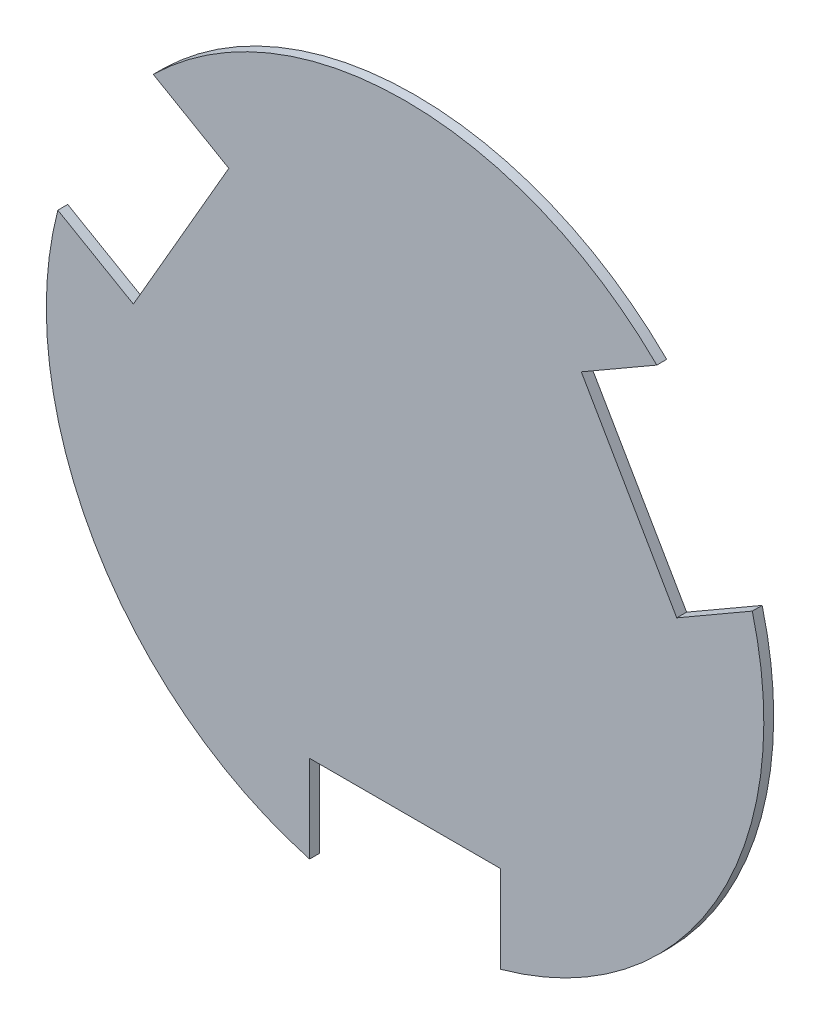
ISO-10303-21;
HEADER;
FILE_DESCRIPTION(('STEP AP214'),'2;1');
FILE_NAME('part.step','',(''),(''),'','','');
FILE_SCHEMA(('AUTOMOTIVE_DESIGN { 1 0 10303 214 1 1 1 1 }'));
ENDSEC;
DATA;
#1=APPLICATION_CONTEXT('core data for automotive mechanical design processes');
#2=APPLICATION_PROTOCOL_DEFINITION('international standard','automotive_design',2000,#1);
#3=PRODUCT_CONTEXT('',#1,'mechanical');
#4=PRODUCT('Part','Part','',(#3));
#5=PRODUCT_RELATED_PRODUCT_CATEGORY('part','',(#4));
#6=PRODUCT_DEFINITION_FORMATION('','',#4);
#7=PRODUCT_DEFINITION_CONTEXT('part definition',#1,'design');
#8=PRODUCT_DEFINITION('design','',#6,#7);
#9=PRODUCT_DEFINITION_SHAPE('','',#8);
#10=(LENGTH_UNIT() NAMED_UNIT(*) SI_UNIT(.MILLI.,.METRE.));
#11=(NAMED_UNIT(*) PLANE_ANGLE_UNIT() SI_UNIT($,.RADIAN.));
#12=(NAMED_UNIT(*) SI_UNIT($,.STERADIAN.) SOLID_ANGLE_UNIT());
#13=UNCERTAINTY_MEASURE_WITH_UNIT(LENGTH_MEASURE(1.E-05),#10,'distance_accuracy_value','');
#14=(GEOMETRIC_REPRESENTATION_CONTEXT(3) GLOBAL_UNCERTAINTY_ASSIGNED_CONTEXT((#13)) GLOBAL_UNIT_ASSIGNED_CONTEXT((#10,
#11,#12)) REPRESENTATION_CONTEXT('',''));
#15=CARTESIAN_POINT('',(0.,0.,0.));
#16=DIRECTION('',(0.,0.,1.));
#17=DIRECTION('',(1.,0.,0.));
#18=AXIS2_PLACEMENT_3D('',#15,#16,#17);
#19=CARTESIAN_POINT('',(0.,0.,3.));
#20=DIRECTION('',(0.,0.,-1.));
#21=DIRECTION('',(-1.,0.,0.));
#22=AXIS2_PLACEMENT_3D('',#19,#20,#21);
#23=CYLINDRICAL_SURFACE('',#22,109.);
#24=CARTESIAN_POINT('',(0.,0.,0.));
#25=DIRECTION('',(0.,0.,1.));
#26=DIRECTION('',(1.,0.,0.));
#27=AXIS2_PLACEMENT_3D('',#24,#25,#26);
#28=CIRCLE('',#27,109.);
#29=CARTESIAN_POINT('',(-105.494505328619,27.4209654365062,0.));
#30=VERTEX_POINT('',#29);
#31=CARTESIAN_POINT('',(-29.,-105.07140429251,0.));
#32=VERTEX_POINT('',#31);
#33=EDGE_CURVE('E244',#30,#32,#28,.T.);
#34=ORIENTED_EDGE('',*,*,#33,.T.);
#35=DIRECTION('',(0.,0.,-1.));
#36=VECTOR('',#35,1.);
#37=CARTESIAN_POINT('',(-29.,-105.07140429251,3.));
#38=LINE('',#37,#36);
#39=CARTESIAN_POINT('',(-29.,-105.07140429251,3.));
#40=VERTEX_POINT('',#39);
#41=EDGE_CURVE('E144',#32,#40,#38,.F.);
#42=ORIENTED_EDGE('',*,*,#41,.T.);
#43=CARTESIAN_POINT('',(0.,0.,3.));
#44=DIRECTION('',(0.,0.,1.));
#45=DIRECTION('',(1.,0.,0.));
#46=AXIS2_PLACEMENT_3D('',#43,#44,#45);
#47=CIRCLE('',#46,109.);
#48=CARTESIAN_POINT('',(-105.494505328619,27.4209654365062,3.));
#49=VERTEX_POINT('',#48);
#50=EDGE_CURVE('E238',#49,#40,#47,.T.);
#51=ORIENTED_EDGE('',*,*,#50,.F.);
#52=DIRECTION('',(0.,0.,-1.));
#53=VECTOR('',#52,1.);
#54=CARTESIAN_POINT('',(-105.494505328619,27.4209654365062,3.));
#55=LINE('',#54,#53);
#56=EDGE_CURVE('E219',#49,#30,#55,.T.);
#57=ORIENTED_EDGE('',*,*,#56,.T.);
#58=EDGE_LOOP('',(#34,#42,#51,#57));
#59=FACE_BOUND('',#58,.T.);
#60=ADVANCED_FACE('F39',(#59),#23,.T.);
#61=CARTESIAN_POINT('',(76.4945053286188,77.6504388560033,0.));
#62=VERTEX_POINT('',#61);
#63=CARTESIAN_POINT('',(-76.4945053286185,77.6504388560036,0.));
#64=VERTEX_POINT('',#63);
#65=EDGE_CURVE('E239',#62,#64,#28,.T.);
#66=ORIENTED_EDGE('',*,*,#65,.T.);
#67=DIRECTION('',(0.,0.,-1.));
#68=VECTOR('',#67,1.);
#69=CARTESIAN_POINT('',(-76.4945053286185,77.6504388560036,3.));
#70=LINE('',#69,#68);
#71=CARTESIAN_POINT('',(-76.4945053286185,77.6504388560036,3.));
#72=VERTEX_POINT('',#71);
#73=EDGE_CURVE('E223',#64,#72,#70,.F.);
#74=ORIENTED_EDGE('',*,*,#73,.T.);
#75=CARTESIAN_POINT('',(76.4945053286188,77.6504388560033,3.));
#76=VERTEX_POINT('',#75);
#77=EDGE_CURVE('E240',#76,#72,#47,.T.);
#78=ORIENTED_EDGE('',*,*,#77,.F.);
#79=DIRECTION('',(0.,0.,-1.));
#80=VECTOR('',#79,1.);
#81=CARTESIAN_POINT('',(76.4945053286188,77.6504388560033,3.));
#82=LINE('',#81,#80);
#83=EDGE_CURVE('E137',#76,#62,#82,.T.);
#84=ORIENTED_EDGE('',*,*,#83,.T.);
#85=EDGE_LOOP('',(#66,#74,#78,#84));
#86=FACE_BOUND('',#85,.T.);
#87=ADVANCED_FACE('F268',(#86),#23,.T.);
#88=CARTESIAN_POINT('',(29.,-105.07140429251,3.));
#89=VERTEX_POINT('',#88);
#90=CARTESIAN_POINT('',(105.494505328619,27.4209654365058,3.));
#91=VERTEX_POINT('',#90);
#92=EDGE_CURVE('E234',#89,#91,#47,.T.);
#93=ORIENTED_EDGE('',*,*,#92,.F.);
#94=DIRECTION('',(0.,0.,-1.));
#95=VECTOR('',#94,1.);
#96=CARTESIAN_POINT('',(29.,-105.07140429251,3.));
#97=LINE('',#96,#95);
#98=CARTESIAN_POINT('',(29.,-105.07140429251,0.));
#99=VERTEX_POINT('',#98);
#100=EDGE_CURVE('E227',#89,#99,#97,.T.);
#101=ORIENTED_EDGE('',*,*,#100,.T.);
#102=CARTESIAN_POINT('',(105.494505328619,27.4209654365058,0.));
#103=VERTEX_POINT('',#102);
#104=EDGE_CURVE('E233',#99,#103,#28,.T.);
#105=ORIENTED_EDGE('',*,*,#104,.T.);
#106=DIRECTION('',(0.,0.,-1.));
#107=VECTOR('',#106,1.);
#108=CARTESIAN_POINT('',(105.494505328619,27.4209654365058,3.));
#109=LINE('',#108,#107);
#110=EDGE_CURVE('E215',#103,#91,#109,.F.);
#111=ORIENTED_EDGE('',*,*,#110,.T.);
#112=EDGE_LOOP('',(#93,#101,#105,#111));
#113=FACE_BOUND('',#112,.T.);
#114=ADVANCED_FACE('F41',(#113),#23,.T.);
#115=CARTESIAN_POINT('',(0.,0.,3.));
#116=DIRECTION('',(0.,0.,1.));
#117=DIRECTION('',(1.,0.,0.));
#118=AXIS2_PLACEMENT_3D('',#115,#116,#117);
#119=PLANE('',#118);
#120=DIRECTION('',(0.,-1.,0.));
#121=VECTOR('',#120,1.);
#122=CARTESIAN_POINT('',(-29.,-120.989097303289,3.));
#123=LINE('',#122,#121);
#124=CARTESIAN_POINT('',(-29.,-78.5714042925096,3.));
#125=VERTEX_POINT('',#124);
#126=EDGE_CURVE('E157',#125,#40,#123,.T.);
#127=ORIENTED_EDGE('',*,*,#126,.F.);
#128=DIRECTION('',(-1.,0.,0.));
#129=VECTOR('',#128,1.);
#130=CARTESIAN_POINT('',(-29.,-78.5714042925096,3.));
#131=LINE('',#130,#129);
#132=CARTESIAN_POINT('',(29.,-78.5714042925096,3.));
#133=VERTEX_POINT('',#132);
#134=EDGE_CURVE('E133',#133,#125,#131,.T.);
#135=ORIENTED_EDGE('',*,*,#134,.F.);
#136=DIRECTION('',(0.,1.,0.));
#137=VECTOR('',#136,1.);
#138=CARTESIAN_POINT('',(29.,-120.989097303289,3.));
#139=LINE('',#138,#137);
#140=EDGE_CURVE('E160',#89,#133,#139,.T.);
#141=ORIENTED_EDGE('',*,*,#140,.F.);
#142=ORIENTED_EDGE('',*,*,#92,.T.);
#143=DIRECTION('',(0.86602540378443,0.500000000000015,0.));
#144=VECTOR('',#143,1.);
#145=CARTESIAN_POINT('',(119.279631845596,35.3798119418958,3.));
#146=LINE('',#145,#144);
#147=CARTESIAN_POINT('',(82.5448321283311,14.1709654365053,3.));
#148=VERTEX_POINT('',#147);
#149=EDGE_CURVE('E198',#148,#91,#146,.T.);
#150=ORIENTED_EDGE('',*,*,#149,.F.);
#151=DIRECTION('',(0.499999999999992,-0.866025403784443,0.));
#152=VECTOR('',#151,1.);
#153=CARTESIAN_POINT('',(82.5448321283311,14.1709654365053,3.));
#154=LINE('',#153,#152);
#155=CARTESIAN_POINT('',(53.5448321283316,64.400438856003,3.));
#156=VERTEX_POINT('',#155);
#157=EDGE_CURVE('E193',#156,#148,#154,.T.);
#158=ORIENTED_EDGE('',*,*,#157,.F.);
#159=DIRECTION('',(-0.86602540378443,-0.500000000000015,0.));
#160=VECTOR('',#159,1.);
#161=CARTESIAN_POINT('',(90.2796318455955,85.6092853613932,3.));
#162=LINE('',#161,#160);
#163=EDGE_CURVE('E201',#76,#156,#162,.T.);
#164=ORIENTED_EDGE('',*,*,#163,.F.);
#165=ORIENTED_EDGE('',*,*,#77,.T.);
#166=DIRECTION('',(-0.866025403784442,0.499999999999994,0.));
#167=VECTOR('',#166,1.);
#168=CARTESIAN_POINT('',(-90.2796318455954,85.6092853613932,3.));
#169=LINE('',#168,#167);
#170=CARTESIAN_POINT('',(-53.5448321283307,64.4004388560038,3.));
#171=VERTEX_POINT('',#170);
#172=EDGE_CURVE('E174',#171,#72,#169,.T.);
#173=ORIENTED_EDGE('',*,*,#172,.F.);
#174=DIRECTION('',(0.500000000000004,0.866025403784436,0.));
#175=VECTOR('',#174,1.);
#176=CARTESIAN_POINT('',(-53.5448321283307,64.4004388560038,3.));
#177=LINE('',#176,#175);
#178=CARTESIAN_POINT('',(-82.5448321283309,14.1709654365065,3.));
#179=VERTEX_POINT('',#178);
#180=EDGE_CURVE('E170',#179,#171,#177,.T.);
#181=ORIENTED_EDGE('',*,*,#180,.F.);
#182=DIRECTION('',(0.866025403784442,-0.499999999999994,0.));
#183=VECTOR('',#182,1.);
#184=CARTESIAN_POINT('',(-119.279631845595,35.3798119418957,3.));
#185=LINE('',#184,#183);
#186=EDGE_CURVE('E177',#49,#179,#185,.T.);
#187=ORIENTED_EDGE('',*,*,#186,.F.);
#188=ORIENTED_EDGE('',*,*,#50,.T.);
#189=EDGE_LOOP('',(#127,#135,#141,#142,#150,#158,#164,#165,#173,#181,#187,#188));
#190=FACE_BOUND('',#189,.T.);
#191=ADVANCED_FACE('F263',(#190),#119,.T.);
#192=CARTESIAN_POINT('',(0.,0.,0.));
#193=DIRECTION('',(0.,0.,1.));
#194=DIRECTION('',(1.,0.,0.));
#195=AXIS2_PLACEMENT_3D('',#192,#193,#194);
#196=PLANE('',#195);
#197=DIRECTION('',(-1.,0.,0.));
#198=VECTOR('',#197,1.);
#199=CARTESIAN_POINT('',(-29.,-78.5714042925096,0.));
#200=LINE('',#199,#198);
#201=CARTESIAN_POINT('',(29.,-78.5714042925096,0.));
#202=VERTEX_POINT('',#201);
#203=CARTESIAN_POINT('',(-29.,-78.5714042925096,0.));
#204=VERTEX_POINT('',#203);
#205=EDGE_CURVE('E55',#202,#204,#200,.T.);
#206=ORIENTED_EDGE('',*,*,#205,.T.);
#207=DIRECTION('',(0.,-1.,0.));
#208=VECTOR('',#207,1.);
#209=CARTESIAN_POINT('',(-29.,-120.989097303289,0.));
#210=LINE('',#209,#208);
#211=EDGE_CURVE('E141',#204,#32,#210,.T.);
#212=ORIENTED_EDGE('',*,*,#211,.T.);
#213=ORIENTED_EDGE('',*,*,#33,.F.);
#214=DIRECTION('',(0.866025403784442,-0.499999999999994,0.));
#215=VECTOR('',#214,1.);
#216=CARTESIAN_POINT('',(-14.4999999999993,-25.114736709748,0.));
#217=LINE('',#216,#215);
#218=CARTESIAN_POINT('',(-82.5448321283309,14.1709654365065,0.));
#219=VERTEX_POINT('',#218);
#220=EDGE_CURVE('E48',#30,#219,#217,.T.);
#221=ORIENTED_EDGE('',*,*,#220,.T.);
#222=DIRECTION('',(0.500000000000004,0.866025403784436,0.));
#223=VECTOR('',#222,1.);
#224=CARTESIAN_POINT('',(-53.5448321283307,64.4004388560038,0.));
#225=LINE('',#224,#223);
#226=CARTESIAN_POINT('',(-53.5448321283307,64.4004388560038,0.));
#227=VERTEX_POINT('',#226);
#228=EDGE_CURVE('E63',#219,#227,#225,.T.);
#229=ORIENTED_EDGE('',*,*,#228,.T.);
#230=DIRECTION('',(-0.866025403784442,0.499999999999994,0.));
#231=VECTOR('',#230,1.);
#232=CARTESIAN_POINT('',(-90.2796318455954,85.6092853613932,0.));
#233=LINE('',#232,#231);
#234=EDGE_CURVE('E166',#227,#64,#233,.T.);
#235=ORIENTED_EDGE('',*,*,#234,.T.);
#236=ORIENTED_EDGE('',*,*,#65,.F.);
#237=DIRECTION('',(-0.86602540378443,-0.500000000000015,0.));
#238=VECTOR('',#237,1.);
#239=CARTESIAN_POINT('',(-14.4999999999994,25.1147367097467,0.));
#240=LINE('',#239,#238);
#241=CARTESIAN_POINT('',(53.5448321283315,64.400438856003,0.));
#242=VERTEX_POINT('',#241);
#243=EDGE_CURVE('E245',#62,#242,#240,.T.);
#244=ORIENTED_EDGE('',*,*,#243,.T.);
#245=DIRECTION('',(0.499999999999992,-0.866025403784443,0.));
#246=VECTOR('',#245,1.);
#247=CARTESIAN_POINT('',(82.5448321283311,14.1709654365053,0.));
#248=LINE('',#247,#246);
#249=CARTESIAN_POINT('',(82.5448321283311,14.1709654365053,0.));
#250=VERTEX_POINT('',#249);
#251=EDGE_CURVE('E192',#242,#250,#248,.T.);
#252=ORIENTED_EDGE('',*,*,#251,.T.);
#253=DIRECTION('',(0.86602540378443,0.500000000000015,0.));
#254=VECTOR('',#253,1.);
#255=CARTESIAN_POINT('',(119.279631845596,35.3798119418958,0.));
#256=LINE('',#255,#254);
#257=EDGE_CURVE('E188',#250,#103,#256,.T.);
#258=ORIENTED_EDGE('',*,*,#257,.T.);
#259=ORIENTED_EDGE('',*,*,#104,.F.);
#260=DIRECTION('',(0.,1.,0.));
#261=VECTOR('',#260,1.);
#262=CARTESIAN_POINT('',(29.,0.,0.));
#263=LINE('',#262,#261);
#264=EDGE_CURVE('E11',#99,#202,#263,.T.);
#265=ORIENTED_EDGE('',*,*,#264,.T.);
#266=EDGE_LOOP('',(#206,#212,#213,#221,#229,#235,#236,#244,#252,#258,#259,#265));
#267=FACE_BOUND('',#266,.T.);
#268=ADVANCED_FACE('F150',(#267),#196,.F.);
#269=CARTESIAN_POINT('',(119.279631845596,35.3798119418958,0.));
#270=DIRECTION('',(0.500000000000015,-0.86602540378443,0.));
#271=DIRECTION('',(0.86602540378443,0.500000000000015,0.));
#272=AXIS2_PLACEMENT_3D('',#269,#270,#271);
#273=PLANE('',#272);
#274=ORIENTED_EDGE('',*,*,#257,.F.);
#275=DIRECTION('',(0.,0.,1.));
#276=VECTOR('',#275,1.);
#277=CARTESIAN_POINT('',(82.5448321283311,14.1709654365053,0.));
#278=LINE('',#277,#276);
#279=EDGE_CURVE('E178',#250,#148,#278,.T.);
#280=ORIENTED_EDGE('',*,*,#279,.T.);
#281=ORIENTED_EDGE('',*,*,#149,.T.);
#282=ORIENTED_EDGE('',*,*,#110,.F.);
#283=EDGE_LOOP('',(#274,#280,#281,#282));
#284=FACE_BOUND('',#283,.T.);
#285=ADVANCED_FACE('F285',(#284),#273,.F.);
#286=CARTESIAN_POINT('',(90.2796318455955,85.6092853613932,0.));
#287=DIRECTION('',(-0.500000000000015,0.86602540378443,0.));
#288=DIRECTION('',(-0.86602540378443,-0.500000000000015,0.));
#289=AXIS2_PLACEMENT_3D('',#286,#287,#288);
#290=PLANE('',#289);
#291=ORIENTED_EDGE('',*,*,#163,.T.);
#292=DIRECTION('',(0.,0.,1.));
#293=VECTOR('',#292,1.);
#294=CARTESIAN_POINT('',(53.5448321283316,64.400438856003,0.));
#295=LINE('',#294,#293);
#296=EDGE_CURVE('E197',#242,#156,#295,.T.);
#297=ORIENTED_EDGE('',*,*,#296,.F.);
#298=ORIENTED_EDGE('',*,*,#243,.F.);
#299=ORIENTED_EDGE('',*,*,#83,.F.);
#300=EDGE_LOOP('',(#291,#297,#298,#299));
#301=FACE_BOUND('',#300,.T.);
#302=ADVANCED_FACE('F277',(#301),#290,.F.);
#303=CARTESIAN_POINT('',(82.5448321283311,14.1709654365053,0.));
#304=DIRECTION('',(-0.866025403784443,-0.499999999999992,0.));
#305=DIRECTION('',(0.499999999999992,-0.866025403784444,0.));
#306=AXIS2_PLACEMENT_3D('',#303,#304,#305);
#307=PLANE('',#306);
#308=ORIENTED_EDGE('',*,*,#157,.T.);
#309=ORIENTED_EDGE('',*,*,#279,.F.);
#310=ORIENTED_EDGE('',*,*,#251,.F.);
#311=ORIENTED_EDGE('',*,*,#296,.T.);
#312=EDGE_LOOP('',(#308,#309,#310,#311));
#313=FACE_BOUND('',#312,.T.);
#314=ADVANCED_FACE('F279',(#313),#307,.F.);
#315=CARTESIAN_POINT('',(-90.2796318455954,85.6092853613932,0.));
#316=DIRECTION('',(0.499999999999994,0.866025403784442,0.));
#317=DIRECTION('',(-0.866025403784442,0.499999999999994,0.));
#318=AXIS2_PLACEMENT_3D('',#315,#316,#317);
#319=PLANE('',#318);
#320=ORIENTED_EDGE('',*,*,#234,.F.);
#321=DIRECTION('',(0.,0.,1.));
#322=VECTOR('',#321,1.);
#323=CARTESIAN_POINT('',(-53.5448321283307,64.4004388560038,0.));
#324=LINE('',#323,#322);
#325=EDGE_CURVE('E161',#227,#171,#324,.T.);
#326=ORIENTED_EDGE('',*,*,#325,.T.);
#327=ORIENTED_EDGE('',*,*,#172,.T.);
#328=ORIENTED_EDGE('',*,*,#73,.F.);
#329=EDGE_LOOP('',(#320,#326,#327,#328));
#330=FACE_BOUND('',#329,.T.);
#331=ADVANCED_FACE('F272',(#330),#319,.F.);
#332=CARTESIAN_POINT('',(-119.279631845595,35.3798119418957,0.));
#333=DIRECTION('',(-0.499999999999994,-0.866025403784442,0.));
#334=DIRECTION('',(0.866025403784442,-0.499999999999994,0.));
#335=AXIS2_PLACEMENT_3D('',#332,#333,#334);
#336=PLANE('',#335);
#337=ORIENTED_EDGE('',*,*,#186,.T.);
#338=DIRECTION('',(0.,0.,1.));
#339=VECTOR('',#338,1.);
#340=CARTESIAN_POINT('',(-82.5448321283309,14.1709654365065,0.));
#341=LINE('',#340,#339);
#342=EDGE_CURVE('E173',#219,#179,#341,.T.);
#343=ORIENTED_EDGE('',*,*,#342,.F.);
#344=ORIENTED_EDGE('',*,*,#220,.F.);
#345=ORIENTED_EDGE('',*,*,#56,.F.);
#346=EDGE_LOOP('',(#337,#343,#344,#345));
#347=FACE_BOUND('',#346,.T.);
#348=ADVANCED_FACE('F251',(#347),#336,.F.);
#349=CARTESIAN_POINT('',(-53.5448321283307,64.4004388560038,0.));
#350=DIRECTION('',(0.866025403784436,-0.500000000000004,0.));
#351=DIRECTION('',(0.500000000000004,0.866025403784436,0.));
#352=AXIS2_PLACEMENT_3D('',#349,#350,#351);
#353=PLANE('',#352);
#354=ORIENTED_EDGE('',*,*,#180,.T.);
#355=ORIENTED_EDGE('',*,*,#325,.F.);
#356=ORIENTED_EDGE('',*,*,#228,.F.);
#357=ORIENTED_EDGE('',*,*,#342,.T.);
#358=EDGE_LOOP('',(#354,#355,#356,#357));
#359=FACE_BOUND('',#358,.T.);
#360=ADVANCED_FACE('F296',(#359),#353,.F.);
#361=CARTESIAN_POINT('',(-29.,-120.989097303289,0.));
#362=DIRECTION('',(-1.,0.,0.));
#363=DIRECTION('',(0.,0.,1.));
#364=AXIS2_PLACEMENT_3D('',#361,#362,#363);
#365=PLANE('',#364);
#366=ORIENTED_EDGE('',*,*,#211,.F.);
#367=DIRECTION('',(0.,0.,1.));
#368=VECTOR('',#367,1.);
#369=CARTESIAN_POINT('',(-29.,-78.5714042925096,0.));
#370=LINE('',#369,#368);
#371=EDGE_CURVE('E129',#204,#125,#370,.T.);
#372=ORIENTED_EDGE('',*,*,#371,.T.);
#373=ORIENTED_EDGE('',*,*,#126,.T.);
#374=ORIENTED_EDGE('',*,*,#41,.F.);
#375=EDGE_LOOP('',(#366,#372,#373,#374));
#376=FACE_BOUND('',#375,.T.);
#377=ADVANCED_FACE('F142',(#376),#365,.F.);
#378=CARTESIAN_POINT('',(29.,-120.989097303289,0.));
#379=DIRECTION('',(1.,0.,0.));
#380=DIRECTION('',(0.,0.,-1.));
#381=AXIS2_PLACEMENT_3D('',#378,#379,#380);
#382=PLANE('',#381);
#383=ORIENTED_EDGE('',*,*,#140,.T.);
#384=DIRECTION('',(0.,0.,1.));
#385=VECTOR('',#384,1.);
#386=CARTESIAN_POINT('',(29.,-78.5714042925096,0.));
#387=LINE('',#386,#385);
#388=EDGE_CURVE('E138',#202,#133,#387,.T.);
#389=ORIENTED_EDGE('',*,*,#388,.F.);
#390=ORIENTED_EDGE('',*,*,#264,.F.);
#391=ORIENTED_EDGE('',*,*,#100,.F.);
#392=EDGE_LOOP('',(#383,#389,#390,#391));
#393=FACE_BOUND('',#392,.T.);
#394=ADVANCED_FACE('F288',(#393),#382,.F.);
#395=CARTESIAN_POINT('',(-29.,-78.5714042925096,0.));
#396=DIRECTION('',(0.,1.,0.));
#397=DIRECTION('',(0.,0.,1.));
#398=AXIS2_PLACEMENT_3D('',#395,#396,#397);
#399=PLANE('',#398);
#400=ORIENTED_EDGE('',*,*,#134,.T.);
#401=ORIENTED_EDGE('',*,*,#371,.F.);
#402=ORIENTED_EDGE('',*,*,#205,.F.);
#403=ORIENTED_EDGE('',*,*,#388,.T.);
#404=EDGE_LOOP('',(#400,#401,#402,#403));
#405=FACE_BOUND('',#404,.T.);
#406=ADVANCED_FACE('F131',(#405),#399,.F.);
#407=CLOSED_SHELL('',(#60,#87,#114,#191,#268,#285,#302,#314,#331,#348,#360,#377,#394,#406));
#408=MANIFOLD_SOLID_BREP('B2',#407);
#409=ADVANCED_BREP_SHAPE_REPRESENTATION('',(#18,#408),#14);
#410=SHAPE_DEFINITION_REPRESENTATION(#9,#409);
ENDSEC;
END-ISO-10303-21;
